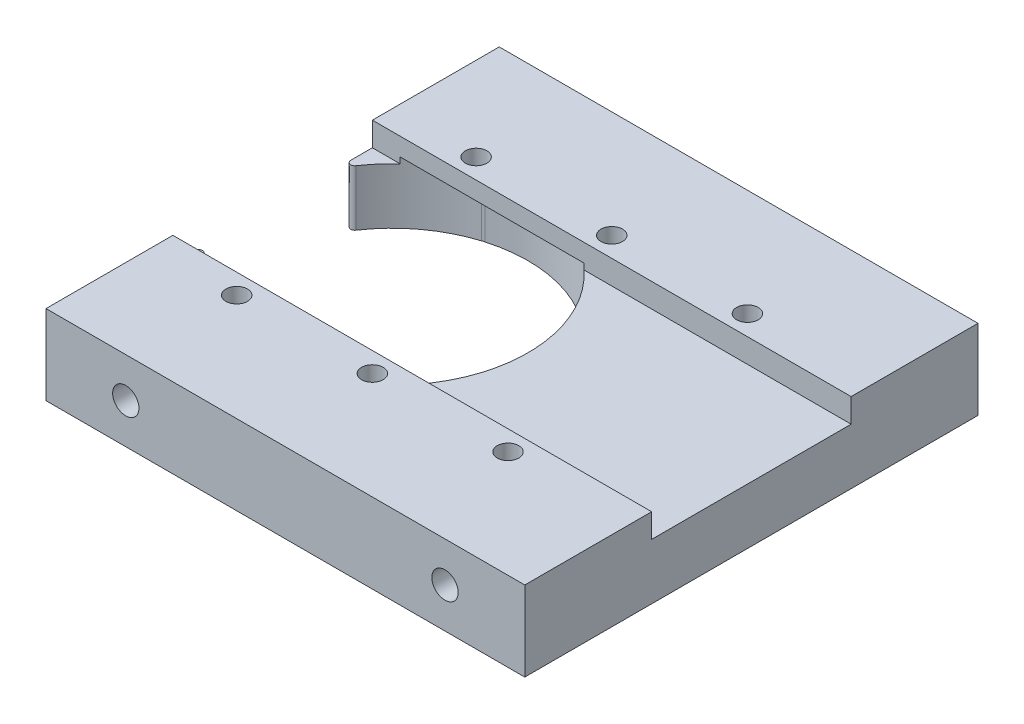
ISO-10303-21;
HEADER;
FILE_DESCRIPTION(('STEP AP214'),'2;1');
FILE_NAME('part.step','',(''),(''),'','','');
FILE_SCHEMA(('AUTOMOTIVE_DESIGN { 1 0 10303 214 1 1 1 1 }'));
ENDSEC;
DATA;
#1=APPLICATION_CONTEXT('core data for automotive mechanical design processes');
#2=APPLICATION_PROTOCOL_DEFINITION('international standard','automotive_design',2000,#1);
#3=PRODUCT_CONTEXT('',#1,'mechanical');
#4=PRODUCT('Part','Part','',(#3));
#5=PRODUCT_RELATED_PRODUCT_CATEGORY('part','',(#4));
#6=PRODUCT_DEFINITION_FORMATION('','',#4);
#7=PRODUCT_DEFINITION_CONTEXT('part definition',#1,'design');
#8=PRODUCT_DEFINITION('design','',#6,#7);
#9=PRODUCT_DEFINITION_SHAPE('','',#8);
#10=(LENGTH_UNIT() NAMED_UNIT(*) SI_UNIT(.MILLI.,.METRE.));
#11=(NAMED_UNIT(*) PLANE_ANGLE_UNIT() SI_UNIT($,.RADIAN.));
#12=(NAMED_UNIT(*) SI_UNIT($,.STERADIAN.) SOLID_ANGLE_UNIT());
#13=UNCERTAINTY_MEASURE_WITH_UNIT(LENGTH_MEASURE(1.E-05),#10,'distance_accuracy_value','');
#14=(GEOMETRIC_REPRESENTATION_CONTEXT(3) GLOBAL_UNCERTAINTY_ASSIGNED_CONTEXT((#13)) GLOBAL_UNIT_ASSIGNED_CONTEXT((#10,
#11,#12)) REPRESENTATION_CONTEXT('',''));
#15=CARTESIAN_POINT('',(0.,0.,0.));
#16=DIRECTION('',(0.,0.,1.));
#17=DIRECTION('',(1.,0.,0.));
#18=AXIS2_PLACEMENT_3D('',#15,#16,#17);
#19=CARTESIAN_POINT('',(0.,7.,0.));
#20=DIRECTION('',(0.,1.,0.));
#21=DIRECTION('',(0.,0.,1.));
#22=AXIS2_PLACEMENT_3D('',#19,#20,#21);
#23=PLANE('',#22);
#24=DIRECTION('',(-1.,0.,0.));
#25=VECTOR('',#24,1.);
#26=CARTESIAN_POINT('',(0.,7.,-6.52105263157888));
#27=LINE('',#26,#25);
#28=CARTESIAN_POINT('',(-32.5947010779433,7.,-6.52105263157891));
#29=VERTEX_POINT('',#28);
#30=CARTESIAN_POINT('',(-36.0729824561403,7.,-6.52105263157891));
#31=VERTEX_POINT('',#30);
#32=EDGE_CURVE('E421',#29,#31,#27,.T.);
#33=ORIENTED_EDGE('',*,*,#32,.T.);
#34=DIRECTION('',(0.,0.,1.));
#35=VECTOR('',#34,1.);
#36=CARTESIAN_POINT('',(-36.0729824561403,7.,0.));
#37=LINE('',#36,#35);
#38=CARTESIAN_POINT('',(-36.0729824561403,7.,-3.81901160271162));
#39=VERTEX_POINT('',#38);
#40=EDGE_CURVE('E495',#31,#39,#37,.T.);
#41=ORIENTED_EDGE('',*,*,#40,.T.);
#42=CARTESIAN_POINT('',(-35.5729824561403,7.,-3.81901160271162));
#43=DIRECTION('',(0.,1.,0.));
#44=DIRECTION('',(0.,0.,1.));
#45=AXIS2_PLACEMENT_3D('',#42,#43,#44);
#46=CIRCLE('',#45,0.5);
#47=CARTESIAN_POINT('',(-35.1586967418546,7.,-3.53906991782212));
#48=VERTEX_POINT('',#47);
#49=EDGE_CURVE('E498',#39,#48,#46,.T.);
#50=ORIENTED_EDGE('',*,*,#49,.T.);
#51=CARTESIAN_POINT('',(-21.0729824561403,7.,5.97894736842108));
#52=DIRECTION('',(0.,1.,0.));
#53=DIRECTION('',(0.,0.,1.));
#54=AXIS2_PLACEMENT_3D('',#51,#52,#53);
#55=CIRCLE('',#54,17.);
#56=EDGE_CURVE('E502',#29,#48,#55,.T.);
#57=ORIENTED_EDGE('',*,*,#56,.F.);
#58=EDGE_LOOP('',(#33,#41,#50,#57));
#59=FACE_BOUND('',#58,.T.);
#60=ADVANCED_FACE('F195',(#59),#23,.T.);
#61=DIRECTION('',(-1.,0.,0.));
#62=VECTOR('',#61,1.);
#63=CARTESIAN_POINT('',(0.,7.,-6.52105263157891));
#64=LINE('',#63,#62);
#65=CARTESIAN_POINT('',(23.9270175438597,7.,-6.52105263157891));
#66=VERTEX_POINT('',#65);
#67=CARTESIAN_POINT('',(-9.55126383433742,7.,-6.52105263157891));
#68=VERTEX_POINT('',#67);
#69=EDGE_CURVE('E341',#66,#68,#64,.T.);
#70=ORIENTED_EDGE('',*,*,#69,.T.);
#71=CARTESIAN_POINT('',(-21.0729824561403,7.,5.97894736842108));
#72=DIRECTION('',(0.,1.,0.));
#73=DIRECTION('',(0.,0.,1.));
#74=AXIS2_PLACEMENT_3D('',#71,#72,#73);
#75=CIRCLE('',#74,17.);
#76=CARTESIAN_POINT('',(-9.55126383433743,7.,18.4789473684211));
#77=VERTEX_POINT('',#76);
#78=EDGE_CURVE('E479',#77,#68,#75,.T.);
#79=ORIENTED_EDGE('',*,*,#78,.F.);
#80=DIRECTION('',(-1.,0.,0.));
#81=VECTOR('',#80,1.);
#82=CARTESIAN_POINT('',(0.,7.,18.4789473684211));
#83=LINE('',#82,#81);
#84=CARTESIAN_POINT('',(23.9270175438597,7.,18.4789473684211));
#85=VERTEX_POINT('',#84);
#86=EDGE_CURVE('E453',#85,#77,#83,.T.);
#87=ORIENTED_EDGE('',*,*,#86,.F.);
#88=DIRECTION('',(0.,0.,1.));
#89=VECTOR('',#88,1.);
#90=CARTESIAN_POINT('',(23.9270175438597,7.,0.));
#91=LINE('',#90,#89);
#92=EDGE_CURVE('E211',#66,#85,#91,.T.);
#93=ORIENTED_EDGE('',*,*,#92,.F.);
#94=EDGE_LOOP('',(#70,#79,#87,#93));
#95=FACE_BOUND('',#94,.T.);
#96=ADVANCED_FACE('F615',(#95),#23,.T.);
#97=CARTESIAN_POINT('',(-25.5729824561403,7.,20.9789473684211));
#98=DIRECTION('',(0.,-1.,0.));
#99=DIRECTION('',(0.,0.,-1.));
#100=AXIS2_PLACEMENT_3D('',#97,#98,#99);
#101=CYLINDRICAL_SURFACE('',#100,1.35);
#102=CARTESIAN_POINT('',(-25.5729824561403,0.,20.9789473684211));
#103=DIRECTION('',(0.,1.,0.));
#104=DIRECTION('',(0.,0.,1.));
#105=AXIS2_PLACEMENT_3D('',#102,#103,#104);
#106=CIRCLE('',#105,1.35);
#107=CARTESIAN_POINT('',(-26.1250182692784,0.,22.210919957813));
#108=VERTEX_POINT('',#107);
#109=CARTESIAN_POINT('',(-25.7902585696078,0.,22.3113478677142));
#110=VERTEX_POINT('',#109);
#111=EDGE_CURVE('E509',#108,#110,#106,.T.);
#112=ORIENTED_EDGE('',*,*,#111,.F.);
#113=DIRECTION('',(0.,-1.,0.));
#114=VECTOR('',#113,1.);
#115=CARTESIAN_POINT('',(-26.1250182692784,7.,22.210919957813));
#116=LINE('',#115,#114);
#117=CARTESIAN_POINT('',(-26.1250182692783,7.75,22.210919957813));
#118=VERTEX_POINT('',#117);
#119=EDGE_CURVE('E580',#118,#108,#116,.T.);
#120=ORIENTED_EDGE('',*,*,#119,.F.);
#121=CARTESIAN_POINT('',(-25.5729824561403,7.75,20.9789473684211));
#122=DIRECTION('',(0.,1.,0.));
#123=DIRECTION('',(0.,0.,1.));
#124=AXIS2_PLACEMENT_3D('',#121,#122,#123);
#125=CIRCLE('',#124,1.35);
#126=CARTESIAN_POINT('',(-25.7902585696078,7.75,22.3113478677142));
#127=VERTEX_POINT('',#126);
#128=EDGE_CURVE('E383',#118,#127,#125,.F.);
#129=ORIENTED_EDGE('',*,*,#128,.T.);
#130=DIRECTION('',(0.,-1.,0.));
#131=VECTOR('',#130,1.);
#132=CARTESIAN_POINT('',(-25.7902585696078,7.,22.3113478677142));
#133=LINE('',#132,#131);
#134=EDGE_CURVE('E583',#127,#110,#133,.T.);
#135=ORIENTED_EDGE('',*,*,#134,.T.);
#136=EDGE_LOOP('',(#112,#120,#129,#135));
#137=FACE_BOUND('',#136,.T.);
#138=CARTESIAN_POINT('',(-25.5729824561403,10.,20.9789473684211));
#139=DIRECTION('',(0.,1.,0.));
#140=DIRECTION('',(0.,0.,1.));
#141=AXIS2_PLACEMENT_3D('',#138,#139,#140);
#142=CIRCLE('',#141,1.35);
#143=CARTESIAN_POINT('',(-25.5729824561403,10.,22.3289473684211));
#144=VERTEX_POINT('',#143);
#145=EDGE_CURVE('E392',#144,#144,#142,.F.);
#146=ORIENTED_EDGE('',*,*,#145,.F.);
#147=EDGE_LOOP('',(#146));
#148=FACE_BOUND('',#147,.T.);
#149=ADVANCED_FACE('F622',(#137,#148),#101,.F.);
#150=CARTESIAN_POINT('',(-21.0729824561403,7.,5.97894736842108));
#151=DIRECTION('',(0.,-1.,0.));
#152=DIRECTION('',(0.,0.,-1.));
#153=AXIS2_PLACEMENT_3D('',#150,#151,#152);
#154=CYLINDRICAL_SURFACE('',#153,17.);
#155=CARTESIAN_POINT('',(-21.0729824561403,0.,5.97894736842108));
#156=DIRECTION('',(0.,1.,0.));
#157=DIRECTION('',(0.,0.,1.));
#158=AXIS2_PLACEMENT_3D('',#155,#156,#157);
#159=CIRCLE('',#158,17.);
#160=CARTESIAN_POINT('',(-35.1586967418546,0.,15.4969646546643));
#161=VERTEX_POINT('',#160);
#162=EDGE_CURVE('E513',#161,#108,#159,.T.);
#163=ORIENTED_EDGE('',*,*,#162,.F.);
#164=DIRECTION('',(0.,-1.,0.));
#165=VECTOR('',#164,1.);
#166=CARTESIAN_POINT('',(-35.1586967418546,7.,15.4969646546643));
#167=LINE('',#166,#165);
#168=CARTESIAN_POINT('',(-35.1586967418546,7.,15.4969646546643));
#169=VERTEX_POINT('',#168);
#170=EDGE_CURVE('E577',#169,#161,#167,.T.);
#171=ORIENTED_EDGE('',*,*,#170,.F.);
#172=CARTESIAN_POINT('',(-21.0729824561403,7.,5.97894736842108));
#173=DIRECTION('',(0.,1.,0.));
#174=DIRECTION('',(0.,0.,1.));
#175=AXIS2_PLACEMENT_3D('',#172,#173,#174);
#176=CIRCLE('',#175,17.);
#177=CARTESIAN_POINT('',(-32.5947010779433,7.,18.4789473684211));
#178=VERTEX_POINT('',#177);
#179=EDGE_CURVE('E483',#169,#178,#176,.T.);
#180=ORIENTED_EDGE('',*,*,#179,.T.);
#181=DIRECTION('',(0.,-1.,0.));
#182=VECTOR('',#181,1.);
#183=CARTESIAN_POINT('',(-32.5947010779433,7.75,18.4789473684211));
#184=LINE('',#183,#182);
#185=CARTESIAN_POINT('',(-32.5947010779433,7.75,18.4789473684211));
#186=VERTEX_POINT('',#185);
#187=EDGE_CURVE('E474',#186,#178,#184,.T.);
#188=ORIENTED_EDGE('',*,*,#187,.F.);
#189=CARTESIAN_POINT('',(-21.0729824561403,7.75,5.97894736842108));
#190=DIRECTION('',(0.,1.,0.));
#191=DIRECTION('',(0.,0.,1.));
#192=AXIS2_PLACEMENT_3D('',#189,#190,#191);
#193=CIRCLE('',#192,17.);
#194=EDGE_CURVE('E448',#118,#186,#193,.F.);
#195=ORIENTED_EDGE('',*,*,#194,.F.);
#196=ORIENTED_EDGE('',*,*,#119,.T.);
#197=EDGE_LOOP('',(#163,#171,#180,#188,#195,#196));
#198=FACE_BOUND('',#197,.T.);
#199=ADVANCED_FACE('F673',(#198),#154,.F.);
#200=CARTESIAN_POINT('',(-35.5729824561403,7.,15.7769063395538));
#201=DIRECTION('',(0.,-1.,0.));
#202=DIRECTION('',(0.,0.,-1.));
#203=AXIS2_PLACEMENT_3D('',#200,#201,#202);
#204=CYLINDRICAL_SURFACE('',#203,0.5);
#205=CARTESIAN_POINT('',(-35.5729824561403,0.,15.7769063395538));
#206=DIRECTION('',(0.,1.,0.));
#207=DIRECTION('',(0.,0.,1.));
#208=AXIS2_PLACEMENT_3D('',#205,#206,#207);
#209=CIRCLE('',#208,0.5);
#210=CARTESIAN_POINT('',(-36.0729824561403,0.,15.7769063395538));
#211=VERTEX_POINT('',#210);
#212=EDGE_CURVE('E517',#161,#211,#209,.T.);
#213=ORIENTED_EDGE('',*,*,#212,.T.);
#214=DIRECTION('',(0.,-1.,0.));
#215=VECTOR('',#214,1.);
#216=CARTESIAN_POINT('',(-36.0729824561403,7.,15.7769063395538));
#217=LINE('',#216,#215);
#218=CARTESIAN_POINT('',(-36.0729824561403,7.,15.7769063395538));
#219=VERTEX_POINT('',#218);
#220=EDGE_CURVE('E573',#219,#211,#217,.T.);
#221=ORIENTED_EDGE('',*,*,#220,.F.);
#222=CARTESIAN_POINT('',(-35.5729824561403,7.,15.7769063395538));
#223=DIRECTION('',(0.,1.,0.));
#224=DIRECTION('',(0.,0.,1.));
#225=AXIS2_PLACEMENT_3D('',#222,#223,#224);
#226=CIRCLE('',#225,0.5);
#227=EDGE_CURVE('E487',#169,#219,#226,.T.);
#228=ORIENTED_EDGE('',*,*,#227,.F.);
#229=ORIENTED_EDGE('',*,*,#170,.T.);
#230=EDGE_LOOP('',(#213,#221,#228,#229));
#231=FACE_BOUND('',#230,.T.);
#232=ADVANCED_FACE('F669',(#231),#204,.T.);
#233=CARTESIAN_POINT('',(-36.0729824561403,7.,0.));
#234=DIRECTION('',(1.,0.,0.));
#235=DIRECTION('',(0.,0.,-1.));
#236=AXIS2_PLACEMENT_3D('',#233,#234,#235);
#237=PLANE('',#236);
#238=DIRECTION('',(0.,0.,1.));
#239=VECTOR('',#238,1.);
#240=CARTESIAN_POINT('',(-36.0729824561403,0.,0.));
#241=LINE('',#240,#239);
#242=CARTESIAN_POINT('',(-36.0729824561403,0.,34.3789473684211));
#243=VERTEX_POINT('',#242);
#244=EDGE_CURVE('E520',#211,#243,#241,.T.);
#245=ORIENTED_EDGE('',*,*,#244,.T.);
#246=DIRECTION('',(0.,-1.,0.));
#247=VECTOR('',#246,1.);
#248=CARTESIAN_POINT('',(-36.0729824561403,7.,34.3789473684211));
#249=LINE('',#248,#247);
#250=CARTESIAN_POINT('',(-36.0729824561403,10.,34.3789473684211));
#251=VERTEX_POINT('',#250);
#252=EDGE_CURVE('E570',#251,#243,#249,.T.);
#253=ORIENTED_EDGE('',*,*,#252,.F.);
#254=DIRECTION('',(0.,0.,1.));
#255=VECTOR('',#254,1.);
#256=CARTESIAN_POINT('',(-36.0729824561403,10.,0.));
#257=LINE('',#256,#255);
#258=CARTESIAN_POINT('',(-36.0729824561403,10.,18.4789473684211));
#259=VERTEX_POINT('',#258);
#260=EDGE_CURVE('E405',#259,#251,#257,.T.);
#261=ORIENTED_EDGE('',*,*,#260,.F.);
#262=DIRECTION('',(0.,-1.,0.));
#263=VECTOR('',#262,1.);
#264=CARTESIAN_POINT('',(-36.0729824561403,7.75,18.4789473684211));
#265=LINE('',#264,#263);
#266=CARTESIAN_POINT('',(-36.0729824561403,7.,18.4789473684211));
#267=VERTEX_POINT('',#266);
#268=EDGE_CURVE('E470',#259,#267,#265,.T.);
#269=ORIENTED_EDGE('',*,*,#268,.T.);
#270=DIRECTION('',(0.,0.,1.));
#271=VECTOR('',#270,1.);
#272=CARTESIAN_POINT('',(-36.0729824561403,7.,0.));
#273=LINE('',#272,#271);
#274=EDGE_CURVE('E490',#219,#267,#273,.T.);
#275=ORIENTED_EDGE('',*,*,#274,.F.);
#276=ORIENTED_EDGE('',*,*,#220,.T.);
#277=EDGE_LOOP('',(#245,#253,#261,#269,#275,#276));
#278=FACE_BOUND('',#277,.T.);
#279=ADVANCED_FACE('F665',(#278),#237,.F.);
#280=CARTESIAN_POINT('',(0.,7.,34.3789473684211));
#281=DIRECTION('',(0.,0.,1.));
#282=DIRECTION('',(1.,0.,0.));
#283=AXIS2_PLACEMENT_3D('',#280,#281,#282);
#284=PLANE('',#283);
#285=CARTESIAN_POINT('',(-26.0729824561403,5.,34.3789473684211));
#286=DIRECTION('',(0.,0.,1.));
#287=DIRECTION('',(1.,0.,0.));
#288=AXIS2_PLACEMENT_3D('',#285,#286,#287);
#289=CIRCLE('',#288,1.65);
#290=CARTESIAN_POINT('',(-24.4229824561403,5.,34.3789473684211));
#291=VERTEX_POINT('',#290);
#292=EDGE_CURVE('E791',#291,#291,#289,.T.);
#293=ORIENTED_EDGE('',*,*,#292,.F.);
#294=EDGE_LOOP('',(#293));
#295=FACE_BOUND('',#294,.T.);
#296=CARTESIAN_POINT('',(13.9270175438597,5.,34.3789473684211));
#297=DIRECTION('',(0.,0.,1.));
#298=DIRECTION('',(1.,0.,0.));
#299=AXIS2_PLACEMENT_3D('',#296,#297,#298);
#300=CIRCLE('',#299,1.65);
#301=CARTESIAN_POINT('',(15.5770175438597,5.,34.3789473684211));
#302=VERTEX_POINT('',#301);
#303=EDGE_CURVE('E776',#302,#302,#300,.T.);
#304=ORIENTED_EDGE('',*,*,#303,.F.);
#305=EDGE_LOOP('',(#304));
#306=FACE_BOUND('',#305,.T.);
#307=DIRECTION('',(-1.,0.,0.));
#308=VECTOR('',#307,1.);
#309=CARTESIAN_POINT('',(0.,0.,34.3789473684211));
#310=LINE('',#309,#308);
#311=CARTESIAN_POINT('',(23.9270175438597,0.,34.3789473684211));
#312=VERTEX_POINT('',#311);
#313=EDGE_CURVE('E524',#312,#243,#310,.T.);
#314=ORIENTED_EDGE('',*,*,#313,.F.);
#315=DIRECTION('',(0.,-1.,0.));
#316=VECTOR('',#315,1.);
#317=CARTESIAN_POINT('',(23.9270175438597,7.,34.3789473684211));
#318=LINE('',#317,#316);
#319=CARTESIAN_POINT('',(23.9270175438597,10.,34.3789473684211));
#320=VERTEX_POINT('',#319);
#321=EDGE_CURVE('E567',#320,#312,#318,.T.);
#322=ORIENTED_EDGE('',*,*,#321,.F.);
#323=DIRECTION('',(1.,0.,0.));
#324=VECTOR('',#323,1.);
#325=CARTESIAN_POINT('',(0.,10.,34.3789473684211));
#326=LINE('',#325,#324);
#327=EDGE_CURVE('E409',#251,#320,#326,.T.);
#328=ORIENTED_EDGE('',*,*,#327,.F.);
#329=ORIENTED_EDGE('',*,*,#252,.T.);
#330=EDGE_LOOP('',(#314,#322,#328,#329));
#331=FACE_BOUND('',#330,.T.);
#332=ADVANCED_FACE('F662',(#295,#306,#331),#284,.T.);
#333=CARTESIAN_POINT('',(23.9270175438597,7.,0.));
#334=DIRECTION('',(1.,0.,0.));
#335=DIRECTION('',(0.,0.,-1.));
#336=AXIS2_PLACEMENT_3D('',#333,#334,#335);
#337=PLANE('',#336);
#338=DIRECTION('',(0.,0.,1.));
#339=VECTOR('',#338,1.);
#340=CARTESIAN_POINT('',(23.9270175438597,0.,0.));
#341=LINE('',#340,#339);
#342=CARTESIAN_POINT('',(23.9270175438597,0.,-22.4210526315789));
#343=VERTEX_POINT('',#342);
#344=EDGE_CURVE('E528',#343,#312,#341,.T.);
#345=ORIENTED_EDGE('',*,*,#344,.F.);
#346=DIRECTION('',(0.,-1.,0.));
#347=VECTOR('',#346,1.);
#348=CARTESIAN_POINT('',(23.9270175438597,7.,-22.4210526315789));
#349=LINE('',#348,#347);
#350=CARTESIAN_POINT('',(23.9270175438597,10.,-22.4210526315789));
#351=VERTEX_POINT('',#350);
#352=EDGE_CURVE('E350',#351,#343,#349,.T.);
#353=ORIENTED_EDGE('',*,*,#352,.F.);
#354=DIRECTION('',(0.,0.,-1.));
#355=VECTOR('',#354,1.);
#356=CARTESIAN_POINT('',(23.9270175438597,10.,0.));
#357=LINE('',#356,#355);
#358=CARTESIAN_POINT('',(23.9270175438597,10.,-6.52105263157891));
#359=VERTEX_POINT('',#358);
#360=EDGE_CURVE('E347',#359,#351,#357,.T.);
#361=ORIENTED_EDGE('',*,*,#360,.F.);
#362=DIRECTION('',(0.,-1.,0.));
#363=VECTOR('',#362,1.);
#364=CARTESIAN_POINT('',(23.9270175438597,7.75,-6.52105263157891));
#365=LINE('',#364,#363);
#366=EDGE_CURVE('E334',#359,#66,#365,.T.);
#367=ORIENTED_EDGE('',*,*,#366,.T.);
#368=ORIENTED_EDGE('',*,*,#92,.T.);
#369=DIRECTION('',(0.,-1.,0.));
#370=VECTOR('',#369,1.);
#371=CARTESIAN_POINT('',(23.9270175438597,7.75,18.4789473684211));
#372=LINE('',#371,#370);
#373=CARTESIAN_POINT('',(23.9270175438597,10.,18.4789473684211));
#374=VERTEX_POINT('',#373);
#375=EDGE_CURVE('E466',#374,#85,#372,.T.);
#376=ORIENTED_EDGE('',*,*,#375,.F.);
#377=DIRECTION('',(0.,0.,-1.));
#378=VECTOR('',#377,1.);
#379=CARTESIAN_POINT('',(23.9270175438597,10.,0.));
#380=LINE('',#379,#378);
#381=EDGE_CURVE('E396',#320,#374,#380,.T.);
#382=ORIENTED_EDGE('',*,*,#381,.F.);
#383=ORIENTED_EDGE('',*,*,#321,.T.);
#384=EDGE_LOOP('',(#345,#353,#361,#367,#368,#376,#382,#383));
#385=FACE_BOUND('',#384,.T.);
#386=ADVANCED_FACE('F349',(#385),#337,.T.);
#387=CARTESIAN_POINT('',(0.,7.,-22.4210526315789));
#388=DIRECTION('',(0.,0.,-1.));
#389=DIRECTION('',(-1.,0.,0.));
#390=AXIS2_PLACEMENT_3D('',#387,#388,#389);
#391=PLANE('',#390);
#392=CARTESIAN_POINT('',(-26.0729824561403,5.,-22.4210526315789));
#393=DIRECTION('',(0.,0.,-1.));
#394=DIRECTION('',(-1.,0.,0.));
#395=AXIS2_PLACEMENT_3D('',#392,#393,#394);
#396=CIRCLE('',#395,1.65);
#397=CARTESIAN_POINT('',(-27.7229824561403,5.,-22.4210526315789));
#398=VERTEX_POINT('',#397);
#399=EDGE_CURVE('E771',#398,#398,#396,.T.);
#400=ORIENTED_EDGE('',*,*,#399,.F.);
#401=EDGE_LOOP('',(#400));
#402=FACE_BOUND('',#401,.T.);
#403=CARTESIAN_POINT('',(13.9270175438597,4.99999999999999,-22.4210526315789));
#404=DIRECTION('',(0.,0.,-1.));
#405=DIRECTION('',(-1.,0.,0.));
#406=AXIS2_PLACEMENT_3D('',#403,#404,#405);
#407=CIRCLE('',#406,1.65);
#408=CARTESIAN_POINT('',(12.2770175438597,4.99999999999999,-22.4210526315789));
#409=VERTEX_POINT('',#408);
#410=EDGE_CURVE('E778',#409,#409,#407,.T.);
#411=ORIENTED_EDGE('',*,*,#410,.F.);
#412=EDGE_LOOP('',(#411));
#413=FACE_BOUND('',#412,.T.);
#414=DIRECTION('',(1.,0.,0.));
#415=VECTOR('',#414,1.);
#416=CARTESIAN_POINT('',(0.,0.,-22.4210526315789));
#417=LINE('',#416,#415);
#418=CARTESIAN_POINT('',(-36.0729824561403,0.,-22.4210526315789));
#419=VERTEX_POINT('',#418);
#420=EDGE_CURVE('E532',#419,#343,#417,.T.);
#421=ORIENTED_EDGE('',*,*,#420,.F.);
#422=DIRECTION('',(0.,-1.,0.));
#423=VECTOR('',#422,1.);
#424=CARTESIAN_POINT('',(-36.0729824561403,7.,-22.4210526315789));
#425=LINE('',#424,#423);
#426=CARTESIAN_POINT('',(-36.0729824561403,10.,-22.4210526315789));
#427=VERTEX_POINT('',#426);
#428=EDGE_CURVE('E562',#427,#419,#425,.T.);
#429=ORIENTED_EDGE('',*,*,#428,.F.);
#430=DIRECTION('',(-1.,0.,0.));
#431=VECTOR('',#430,1.);
#432=CARTESIAN_POINT('',(0.,10.,-22.4210526315789));
#433=LINE('',#432,#431);
#434=EDGE_CURVE('E355',#351,#427,#433,.T.);
#435=ORIENTED_EDGE('',*,*,#434,.F.);
#436=ORIENTED_EDGE('',*,*,#352,.T.);
#437=EDGE_LOOP('',(#421,#429,#435,#436));
#438=FACE_BOUND('',#437,.T.);
#439=ADVANCED_FACE('F655',(#402,#413,#438),#391,.T.);
#440=CARTESIAN_POINT('',(-36.0729824561403,7.,0.));
#441=DIRECTION('',(1.,0.,0.));
#442=DIRECTION('',(0.,0.,-1.));
#443=AXIS2_PLACEMENT_3D('',#440,#441,#442);
#444=PLANE('',#443);
#445=DIRECTION('',(0.,0.,1.));
#446=VECTOR('',#445,1.);
#447=CARTESIAN_POINT('',(-36.0729824561403,0.,0.));
#448=LINE('',#447,#446);
#449=CARTESIAN_POINT('',(-36.0729824561403,0.,-3.81901160271162));
#450=VERTEX_POINT('',#449);
#451=EDGE_CURVE('E536',#419,#450,#448,.T.);
#452=ORIENTED_EDGE('',*,*,#451,.T.);
#453=DIRECTION('',(0.,-1.,0.));
#454=VECTOR('',#453,1.);
#455=CARTESIAN_POINT('',(-36.0729824561403,7.,-3.81901160271162));
#456=LINE('',#455,#454);
#457=EDGE_CURVE('E558',#39,#450,#456,.T.);
#458=ORIENTED_EDGE('',*,*,#457,.F.);
#459=ORIENTED_EDGE('',*,*,#40,.F.);
#460=DIRECTION('',(0.,-1.,0.));
#461=VECTOR('',#460,1.);
#462=CARTESIAN_POINT('',(-36.0729824561403,7.75,-6.52105263157891));
#463=LINE('',#462,#461);
#464=CARTESIAN_POINT('',(-36.0729824561403,10.,-6.52105263157891));
#465=VERTEX_POINT('',#464);
#466=EDGE_CURVE('E344',#465,#31,#463,.T.);
#467=ORIENTED_EDGE('',*,*,#466,.F.);
#468=DIRECTION('',(0.,0.,1.));
#469=VECTOR('',#468,1.);
#470=CARTESIAN_POINT('',(-36.0729824561403,10.,0.));
#471=LINE('',#470,#469);
#472=EDGE_CURVE('E361',#427,#465,#471,.T.);
#473=ORIENTED_EDGE('',*,*,#472,.F.);
#474=ORIENTED_EDGE('',*,*,#428,.T.);
#475=EDGE_LOOP('',(#452,#458,#459,#467,#473,#474));
#476=FACE_BOUND('',#475,.T.);
#477=ADVANCED_FACE('F651',(#476),#444,.F.);
#478=CARTESIAN_POINT('',(-35.5729824561403,7.,-3.81901160271162));
#479=DIRECTION('',(0.,-1.,0.));
#480=DIRECTION('',(0.,0.,-1.));
#481=AXIS2_PLACEMENT_3D('',#478,#479,#480);
#482=CYLINDRICAL_SURFACE('',#481,0.5);
#483=CARTESIAN_POINT('',(-35.5729824561403,0.,-3.81901160271162));
#484=DIRECTION('',(0.,1.,0.));
#485=DIRECTION('',(0.,0.,1.));
#486=AXIS2_PLACEMENT_3D('',#483,#484,#485);
#487=CIRCLE('',#486,0.5);
#488=CARTESIAN_POINT('',(-35.1586967418546,0.,-3.53906991782212));
#489=VERTEX_POINT('',#488);
#490=EDGE_CURVE('E539',#450,#489,#487,.T.);
#491=ORIENTED_EDGE('',*,*,#490,.T.);
#492=DIRECTION('',(0.,-1.,0.));
#493=VECTOR('',#492,1.);
#494=CARTESIAN_POINT('',(-35.1586967418546,7.,-3.53906991782212));
#495=LINE('',#494,#493);
#496=EDGE_CURVE('E555',#48,#489,#495,.T.);
#497=ORIENTED_EDGE('',*,*,#496,.F.);
#498=ORIENTED_EDGE('',*,*,#49,.F.);
#499=ORIENTED_EDGE('',*,*,#457,.T.);
#500=EDGE_LOOP('',(#491,#497,#498,#499));
#501=FACE_BOUND('',#500,.T.);
#502=ADVANCED_FACE('F647',(#501),#482,.T.);
#503=CARTESIAN_POINT('',(-21.0729824561403,7.,5.97894736842108));
#504=DIRECTION('',(0.,-1.,0.));
#505=DIRECTION('',(0.,0.,-1.));
#506=AXIS2_PLACEMENT_3D('',#503,#504,#505);
#507=CYLINDRICAL_SURFACE('',#506,17.);
#508=CARTESIAN_POINT('',(-21.0729824561403,0.,5.97894736842108));
#509=DIRECTION('',(0.,1.,0.));
#510=DIRECTION('',(0.,0.,1.));
#511=AXIS2_PLACEMENT_3D('',#508,#509,#510);
#512=CIRCLE('',#511,17.);
#513=CARTESIAN_POINT('',(-26.1250182692783,0.,-10.2530252209709));
#514=VERTEX_POINT('',#513);
#515=EDGE_CURVE('E543',#514,#489,#512,.T.);
#516=ORIENTED_EDGE('',*,*,#515,.F.);
#517=DIRECTION('',(0.,-1.,0.));
#518=VECTOR('',#517,1.);
#519=CARTESIAN_POINT('',(-26.1250182692783,7.,-10.2530252209709));
#520=LINE('',#519,#518);
#521=CARTESIAN_POINT('',(-26.1250182692783,7.75,-10.2530252209709));
#522=VERTEX_POINT('',#521);
#523=EDGE_CURVE('E552',#522,#514,#520,.T.);
#524=ORIENTED_EDGE('',*,*,#523,.F.);
#525=CARTESIAN_POINT('',(-21.0729824561403,7.75,5.97894736842108));
#526=DIRECTION('',(0.,1.,0.));
#527=DIRECTION('',(0.,0.,1.));
#528=AXIS2_PLACEMENT_3D('',#525,#526,#527);
#529=CIRCLE('',#528,17.);
#530=CARTESIAN_POINT('',(-32.5947010779433,7.75,-6.52105263157891));
#531=VERTEX_POINT('',#530);
#532=EDGE_CURVE('E428',#531,#522,#529,.F.);
#533=ORIENTED_EDGE('',*,*,#532,.F.);
#534=DIRECTION('',(0.,-1.,0.));
#535=VECTOR('',#534,1.);
#536=CARTESIAN_POINT('',(-32.5947010779433,7.75,-6.52105263157891));
#537=LINE('',#536,#535);
#538=EDGE_CURVE('E445',#531,#29,#537,.T.);
#539=ORIENTED_EDGE('',*,*,#538,.T.);
#540=ORIENTED_EDGE('',*,*,#56,.T.);
#541=ORIENTED_EDGE('',*,*,#496,.T.);
#542=EDGE_LOOP('',(#516,#524,#533,#539,#540,#541));
#543=FACE_BOUND('',#542,.T.);
#544=ADVANCED_FACE('F643',(#543),#507,.F.);
#545=CARTESIAN_POINT('',(-25.5729824561403,7.,-9.02105263157891));
#546=DIRECTION('',(0.,-1.,0.));
#547=DIRECTION('',(0.,0.,-1.));
#548=AXIS2_PLACEMENT_3D('',#545,#546,#547);
#549=CYLINDRICAL_SURFACE('',#548,1.35);
#550=CARTESIAN_POINT('',(-25.5729824561403,0.,-9.02105263157891));
#551=DIRECTION('',(0.,1.,0.));
#552=DIRECTION('',(0.,0.,1.));
#553=AXIS2_PLACEMENT_3D('',#550,#551,#552);
#554=CIRCLE('',#553,1.35);
#555=CARTESIAN_POINT('',(-25.7902585696079,0.,-10.353453130872));
#556=VERTEX_POINT('',#555);
#557=EDGE_CURVE('E484',#556,#514,#554,.T.);
#558=ORIENTED_EDGE('',*,*,#557,.F.);
#559=DIRECTION('',(0.,-1.,0.));
#560=VECTOR('',#559,1.);
#561=CARTESIAN_POINT('',(-25.7902585696079,7.,-10.353453130872));
#562=LINE('',#561,#560);
#563=CARTESIAN_POINT('',(-25.7902585696079,7.75,-10.353453130872));
#564=VERTEX_POINT('',#563);
#565=EDGE_CURVE('E505',#564,#556,#562,.T.);
#566=ORIENTED_EDGE('',*,*,#565,.F.);
#567=CARTESIAN_POINT('',(-25.5729824561403,7.75,-9.02105263157891));
#568=DIRECTION('',(0.,1.,0.));
#569=DIRECTION('',(0.,0.,1.));
#570=AXIS2_PLACEMENT_3D('',#567,#568,#569);
#571=CIRCLE('',#570,1.35);
#572=EDGE_CURVE('E384',#564,#522,#571,.F.);
#573=ORIENTED_EDGE('',*,*,#572,.T.);
#574=ORIENTED_EDGE('',*,*,#523,.T.);
#575=EDGE_LOOP('',(#558,#566,#573,#574));
#576=FACE_BOUND('',#575,.T.);
#577=CARTESIAN_POINT('',(-25.5729824561403,10.,-9.02105263157891));
#578=DIRECTION('',(0.,1.,0.));
#579=DIRECTION('',(0.,0.,1.));
#580=AXIS2_PLACEMENT_3D('',#577,#578,#579);
#581=CIRCLE('',#580,1.35);
#582=CARTESIAN_POINT('',(-25.5729824561403,10.,-7.67105263157891));
#583=VERTEX_POINT('',#582);
#584=EDGE_CURVE('E363',#583,#583,#581,.F.);
#585=ORIENTED_EDGE('',*,*,#584,.F.);
#586=EDGE_LOOP('',(#585));
#587=FACE_BOUND('',#586,.T.);
#588=ADVANCED_FACE('F638',(#576,#587),#549,.F.);
#589=CARTESIAN_POINT('',(-21.0729824561403,7.,5.97894736842108));
#590=DIRECTION('',(0.,-1.,0.));
#591=DIRECTION('',(0.,0.,-1.));
#592=AXIS2_PLACEMENT_3D('',#589,#590,#591);
#593=CYLINDRICAL_SURFACE('',#592,17.);
#594=CARTESIAN_POINT('',(-21.0729824561403,0.,5.97894736842108));
#595=DIRECTION('',(0.,1.,0.));
#596=DIRECTION('',(0.,0.,1.));
#597=AXIS2_PLACEMENT_3D('',#594,#595,#596);
#598=CIRCLE('',#597,17.);
#599=EDGE_CURVE('E478',#110,#556,#598,.T.);
#600=ORIENTED_EDGE('',*,*,#599,.F.);
#601=ORIENTED_EDGE('',*,*,#134,.F.);
#602=CARTESIAN_POINT('',(-21.0729824561403,7.75,5.97894736842108));
#603=DIRECTION('',(0.,1.,0.));
#604=DIRECTION('',(0.,0.,1.));
#605=AXIS2_PLACEMENT_3D('',#602,#603,#604);
#606=CIRCLE('',#605,17.);
#607=CARTESIAN_POINT('',(-9.55126383433743,7.75,18.4789473684211));
#608=VERTEX_POINT('',#607);
#609=EDGE_CURVE('E452',#608,#127,#606,.F.);
#610=ORIENTED_EDGE('',*,*,#609,.F.);
#611=DIRECTION('',(0.,-1.,0.));
#612=VECTOR('',#611,1.);
#613=CARTESIAN_POINT('',(-9.55126383433743,7.75,18.4789473684211));
#614=LINE('',#613,#612);
#615=EDGE_CURVE('E457',#608,#77,#614,.T.);
#616=ORIENTED_EDGE('',*,*,#615,.T.);
#617=ORIENTED_EDGE('',*,*,#78,.T.);
#618=DIRECTION('',(0.,-1.,0.));
#619=VECTOR('',#618,1.);
#620=CARTESIAN_POINT('',(-9.55126383433742,7.75,-6.52105263157891));
#621=LINE('',#620,#619);
#622=CARTESIAN_POINT('',(-9.55126383433742,7.75,-6.52105263157891));
#623=VERTEX_POINT('',#622);
#624=EDGE_CURVE('E343',#623,#68,#621,.T.);
#625=ORIENTED_EDGE('',*,*,#624,.F.);
#626=CARTESIAN_POINT('',(-21.0729824561403,7.75,5.97894736842108));
#627=DIRECTION('',(0.,1.,0.));
#628=DIRECTION('',(0.,0.,1.));
#629=AXIS2_PLACEMENT_3D('',#626,#627,#628);
#630=CIRCLE('',#629,17.);
#631=EDGE_CURVE('E432',#564,#623,#630,.F.);
#632=ORIENTED_EDGE('',*,*,#631,.F.);
#633=ORIENTED_EDGE('',*,*,#565,.T.);
#634=EDGE_LOOP('',(#600,#601,#610,#616,#617,#625,#632,#633));
#635=FACE_BOUND('',#634,.T.);
#636=ADVANCED_FACE('F197',(#635),#593,.F.);
#637=CARTESIAN_POINT('',(0.,0.,0.));
#638=DIRECTION('',(0.,1.,0.));
#639=DIRECTION('',(0.,0.,1.));
#640=AXIS2_PLACEMENT_3D('',#637,#638,#639);
#641=PLANE('',#640);
#642=ORIENTED_EDGE('',*,*,#599,.T.);
#643=ORIENTED_EDGE('',*,*,#557,.T.);
#644=ORIENTED_EDGE('',*,*,#515,.T.);
#645=ORIENTED_EDGE('',*,*,#490,.F.);
#646=ORIENTED_EDGE('',*,*,#451,.F.);
#647=ORIENTED_EDGE('',*,*,#420,.T.);
#648=ORIENTED_EDGE('',*,*,#344,.T.);
#649=ORIENTED_EDGE('',*,*,#313,.T.);
#650=ORIENTED_EDGE('',*,*,#244,.F.);
#651=ORIENTED_EDGE('',*,*,#212,.F.);
#652=ORIENTED_EDGE('',*,*,#162,.T.);
#653=ORIENTED_EDGE('',*,*,#111,.T.);
#654=EDGE_LOOP('',(#642,#643,#644,#645,#646,#647,#648,#649,#650,#651,#652,#653));
#655=FACE_BOUND('',#654,.T.);
#656=ADVANCED_FACE('F628',(#655),#641,.F.);
#657=DIRECTION('',(-1.,0.,0.));
#658=VECTOR('',#657,1.);
#659=CARTESIAN_POINT('',(0.,7.,18.4789473684211));
#660=LINE('',#659,#658);
#661=EDGE_CURVE('E219',#178,#267,#660,.T.);
#662=ORIENTED_EDGE('',*,*,#661,.F.);
#663=ORIENTED_EDGE('',*,*,#179,.F.);
#664=ORIENTED_EDGE('',*,*,#227,.T.);
#665=ORIENTED_EDGE('',*,*,#274,.T.);
#666=EDGE_LOOP('',(#662,#663,#664,#665));
#667=FACE_BOUND('',#666,.T.);
#668=ADVANCED_FACE('F618',(#667),#23,.T.);
#669=CARTESIAN_POINT('',(0.,7.75,18.4789473684211));
#670=DIRECTION('',(0.,0.,1.));
#671=DIRECTION('',(1.,0.,0.));
#672=AXIS2_PLACEMENT_3D('',#669,#670,#671);
#673=PLANE('',#672);
#674=ORIENTED_EDGE('',*,*,#661,.T.);
#675=ORIENTED_EDGE('',*,*,#268,.F.);
#676=DIRECTION('',(-1.,0.,0.));
#677=VECTOR('',#676,1.);
#678=CARTESIAN_POINT('',(0.,10.,18.4789473684211));
#679=LINE('',#678,#677);
#680=EDGE_CURVE('E401',#374,#259,#679,.T.);
#681=ORIENTED_EDGE('',*,*,#680,.F.);
#682=ORIENTED_EDGE('',*,*,#375,.T.);
#683=ORIENTED_EDGE('',*,*,#86,.T.);
#684=ORIENTED_EDGE('',*,*,#615,.F.);
#685=DIRECTION('',(-1.,0.,0.));
#686=VECTOR('',#685,1.);
#687=CARTESIAN_POINT('',(0.,7.75,18.4789473684211));
#688=LINE('',#687,#686);
#689=EDGE_CURVE('E397',#608,#186,#688,.T.);
#690=ORIENTED_EDGE('',*,*,#689,.T.);
#691=ORIENTED_EDGE('',*,*,#187,.T.);
#692=EDGE_LOOP('',(#674,#675,#681,#682,#683,#684,#690,#691));
#693=FACE_BOUND('',#692,.T.);
#694=ADVANCED_FACE('F627',(#693),#673,.F.);
#695=CARTESIAN_POINT('',(0.,7.75,-6.52105263157888));
#696=DIRECTION('',(0.,0.,1.));
#697=DIRECTION('',(1.,0.,0.));
#698=AXIS2_PLACEMENT_3D('',#695,#696,#697);
#699=PLANE('',#698);
#700=ORIENTED_EDGE('',*,*,#32,.F.);
#701=ORIENTED_EDGE('',*,*,#538,.F.);
#702=DIRECTION('',(1.,0.,0.));
#703=VECTOR('',#702,1.);
#704=CARTESIAN_POINT('',(0.,7.75,-6.52105263157888));
#705=LINE('',#704,#703);
#706=EDGE_CURVE('E367',#531,#623,#705,.T.);
#707=ORIENTED_EDGE('',*,*,#706,.T.);
#708=ORIENTED_EDGE('',*,*,#624,.T.);
#709=ORIENTED_EDGE('',*,*,#69,.F.);
#710=ORIENTED_EDGE('',*,*,#366,.F.);
#711=DIRECTION('',(1.,0.,0.));
#712=VECTOR('',#711,1.);
#713=CARTESIAN_POINT('',(0.,10.,-6.52105263157888));
#714=LINE('',#713,#712);
#715=EDGE_CURVE('E339',#465,#359,#714,.T.);
#716=ORIENTED_EDGE('',*,*,#715,.F.);
#717=ORIENTED_EDGE('',*,*,#466,.T.);
#718=EDGE_LOOP('',(#700,#701,#707,#708,#709,#710,#716,#717));
#719=FACE_BOUND('',#718,.T.);
#720=ADVANCED_FACE('F337',(#719),#699,.T.);
#721=CARTESIAN_POINT('',(8.42701754385967,10.,20.9789473684211));
#722=DIRECTION('',(0.,-1.,0.));
#723=DIRECTION('',(0.,0.,-1.));
#724=AXIS2_PLACEMENT_3D('',#721,#722,#723);
#725=CYLINDRICAL_SURFACE('',#724,1.35);
#726=CARTESIAN_POINT('',(8.42701754385967,10.,20.9789473684211));
#727=DIRECTION('',(0.,1.,0.));
#728=DIRECTION('',(0.,0.,1.));
#729=AXIS2_PLACEMENT_3D('',#726,#727,#728);
#730=CIRCLE('',#729,1.35);
#731=CARTESIAN_POINT('',(8.42701754385967,10.,22.3289473684211));
#732=VERTEX_POINT('',#731);
#733=EDGE_CURVE('E413',#732,#732,#730,.T.);
#734=ORIENTED_EDGE('',*,*,#733,.T.);
#735=EDGE_LOOP('',(#734));
#736=FACE_BOUND('',#735,.T.);
#737=CARTESIAN_POINT('',(8.42701754385967,7.75,20.9789473684211));
#738=DIRECTION('',(0.,1.,0.));
#739=DIRECTION('',(0.,0.,1.));
#740=AXIS2_PLACEMENT_3D('',#737,#738,#739);
#741=CIRCLE('',#740,1.35);
#742=CARTESIAN_POINT('',(8.42701754385967,7.75,22.3289473684211));
#743=VERTEX_POINT('',#742);
#744=EDGE_CURVE('E590',#743,#743,#741,.F.);
#745=ORIENTED_EDGE('',*,*,#744,.T.);
#746=EDGE_LOOP('',(#745));
#747=FACE_BOUND('',#746,.T.);
#748=ADVANCED_FACE('F700',(#736,#747),#725,.F.);
#749=CARTESIAN_POINT('',(-8.57298245614033,10.,20.9789473684211));
#750=DIRECTION('',(0.,-1.,0.));
#751=DIRECTION('',(0.,0.,-1.));
#752=AXIS2_PLACEMENT_3D('',#749,#750,#751);
#753=CYLINDRICAL_SURFACE('',#752,1.35);
#754=CARTESIAN_POINT('',(-8.57298245614033,10.,20.9789473684211));
#755=DIRECTION('',(0.,1.,0.));
#756=DIRECTION('',(0.,0.,1.));
#757=AXIS2_PLACEMENT_3D('',#754,#755,#756);
#758=CIRCLE('',#757,1.35);
#759=CARTESIAN_POINT('',(-8.57298245614033,10.,22.3289473684211));
#760=VERTEX_POINT('',#759);
#761=EDGE_CURVE('E417',#760,#760,#758,.T.);
#762=ORIENTED_EDGE('',*,*,#761,.T.);
#763=EDGE_LOOP('',(#762));
#764=FACE_BOUND('',#763,.T.);
#765=CARTESIAN_POINT('',(-8.57298245614033,7.75,20.9789473684211));
#766=DIRECTION('',(0.,1.,0.));
#767=DIRECTION('',(0.,0.,1.));
#768=AXIS2_PLACEMENT_3D('',#765,#766,#767);
#769=CIRCLE('',#768,1.35);
#770=CARTESIAN_POINT('',(-8.57298245614033,7.75,22.3289473684211));
#771=VERTEX_POINT('',#770);
#772=EDGE_CURVE('E586',#771,#771,#769,.F.);
#773=ORIENTED_EDGE('',*,*,#772,.T.);
#774=EDGE_LOOP('',(#773));
#775=FACE_BOUND('',#774,.T.);
#776=ADVANCED_FACE('F690',(#764,#775),#753,.F.);
#777=CARTESIAN_POINT('',(0.,10.,0.));
#778=DIRECTION('',(0.,1.,0.));
#779=DIRECTION('',(0.,0.,1.));
#780=AXIS2_PLACEMENT_3D('',#777,#778,#779);
#781=PLANE('',#780);
#782=ORIENTED_EDGE('',*,*,#145,.T.);
#783=EDGE_LOOP('',(#782));
#784=FACE_BOUND('',#783,.T.);
#785=ORIENTED_EDGE('',*,*,#381,.T.);
#786=ORIENTED_EDGE('',*,*,#680,.T.);
#787=ORIENTED_EDGE('',*,*,#260,.T.);
#788=ORIENTED_EDGE('',*,*,#327,.T.);
#789=EDGE_LOOP('',(#785,#786,#787,#788));
#790=FACE_BOUND('',#789,.T.);
#791=ORIENTED_EDGE('',*,*,#733,.F.);
#792=EDGE_LOOP('',(#791));
#793=FACE_BOUND('',#792,.T.);
#794=ORIENTED_EDGE('',*,*,#761,.F.);
#795=EDGE_LOOP('',(#794));
#796=FACE_BOUND('',#795,.T.);
#797=ADVANCED_FACE('F686',(#784,#790,#793,#796),#781,.T.);
#798=CARTESIAN_POINT('',(0.,7.75,0.));
#799=DIRECTION('',(0.,1.,0.));
#800=DIRECTION('',(0.,0.,1.));
#801=AXIS2_PLACEMENT_3D('',#798,#799,#800);
#802=PLANE('',#801);
#803=ORIENTED_EDGE('',*,*,#194,.T.);
#804=ORIENTED_EDGE('',*,*,#689,.F.);
#805=ORIENTED_EDGE('',*,*,#609,.T.);
#806=ORIENTED_EDGE('',*,*,#128,.F.);
#807=EDGE_LOOP('',(#803,#804,#805,#806));
#808=FACE_BOUND('',#807,.T.);
#809=ADVANCED_FACE('F689',(#808),#802,.F.);
#810=CARTESIAN_POINT('',(0.,7.75,0.));
#811=DIRECTION('',(0.,1.,0.));
#812=DIRECTION('',(0.,0.,1.));
#813=AXIS2_PLACEMENT_3D('',#810,#811,#812);
#814=PLANE('',#813);
#815=ORIENTED_EDGE('',*,*,#772,.F.);
#816=EDGE_LOOP('',(#815));
#817=FACE_BOUND('',#816,.T.);
#818=ADVANCED_FACE('F704',(#817),#814,.T.);
#819=ORIENTED_EDGE('',*,*,#744,.F.);
#820=EDGE_LOOP('',(#819));
#821=FACE_BOUND('',#820,.T.);
#822=ADVANCED_FACE('F706',(#821),#814,.T.);
#823=CARTESIAN_POINT('',(-8.57298245614034,10.,-9.02105263157891));
#824=DIRECTION('',(0.,-1.,0.));
#825=DIRECTION('',(0.,0.,-1.));
#826=AXIS2_PLACEMENT_3D('',#823,#824,#825);
#827=CYLINDRICAL_SURFACE('',#826,1.35);
#828=CARTESIAN_POINT('',(-8.57298245614034,10.,-9.02105263157891));
#829=DIRECTION('',(0.,1.,0.));
#830=DIRECTION('',(0.,0.,1.));
#831=AXIS2_PLACEMENT_3D('',#828,#829,#830);
#832=CIRCLE('',#831,1.35);
#833=CARTESIAN_POINT('',(-8.57298245614034,10.,-7.67105263157891));
#834=VERTEX_POINT('',#833);
#835=EDGE_CURVE('E375',#834,#834,#832,.T.);
#836=ORIENTED_EDGE('',*,*,#835,.T.);
#837=EDGE_LOOP('',(#836));
#838=FACE_BOUND('',#837,.T.);
#839=CARTESIAN_POINT('',(-8.57298245614034,7.75,-9.02105263157891));
#840=DIRECTION('',(0.,1.,0.));
#841=DIRECTION('',(0.,0.,1.));
#842=AXIS2_PLACEMENT_3D('',#839,#840,#841);
#843=CIRCLE('',#842,1.35);
#844=CARTESIAN_POINT('',(-8.57298245614034,7.75,-7.67105263157891));
#845=VERTEX_POINT('',#844);
#846=EDGE_CURVE('E12',#845,#845,#843,.F.);
#847=ORIENTED_EDGE('',*,*,#846,.T.);
#848=EDGE_LOOP('',(#847));
#849=FACE_BOUND('',#848,.T.);
#850=ADVANCED_FACE('F712',(#838,#849),#827,.F.);
#851=CARTESIAN_POINT('',(8.42701754385966,10.,-9.02105263157891));
#852=DIRECTION('',(0.,-1.,0.));
#853=DIRECTION('',(0.,0.,-1.));
#854=AXIS2_PLACEMENT_3D('',#851,#852,#853);
#855=CYLINDRICAL_SURFACE('',#854,1.35);
#856=CARTESIAN_POINT('',(8.42701754385966,10.,-9.02105263157891));
#857=DIRECTION('',(0.,1.,0.));
#858=DIRECTION('',(0.,0.,1.));
#859=AXIS2_PLACEMENT_3D('',#856,#857,#858);
#860=CIRCLE('',#859,1.35);
#861=CARTESIAN_POINT('',(8.42701754385966,10.,-7.67105263157891));
#862=VERTEX_POINT('',#861);
#863=EDGE_CURVE('E379',#862,#862,#860,.T.);
#864=ORIENTED_EDGE('',*,*,#863,.T.);
#865=EDGE_LOOP('',(#864));
#866=FACE_BOUND('',#865,.T.);
#867=CARTESIAN_POINT('',(8.42701754385966,7.75,-9.02105263157891));
#868=DIRECTION('',(0.,1.,0.));
#869=DIRECTION('',(0.,0.,1.));
#870=AXIS2_PLACEMENT_3D('',#867,#868,#869);
#871=CIRCLE('',#870,1.35);
#872=CARTESIAN_POINT('',(8.42701754385966,7.75,-7.67105263157891));
#873=VERTEX_POINT('',#872);
#874=EDGE_CURVE('E204',#873,#873,#871,.F.);
#875=ORIENTED_EDGE('',*,*,#874,.T.);
#876=EDGE_LOOP('',(#875));
#877=FACE_BOUND('',#876,.T.);
#878=ADVANCED_FACE('F597',(#866,#877),#855,.F.);
#879=CARTESIAN_POINT('',(0.,10.,0.));
#880=DIRECTION('',(0.,1.,0.));
#881=DIRECTION('',(0.,0.,1.));
#882=AXIS2_PLACEMENT_3D('',#879,#880,#881);
#883=PLANE('',#882);
#884=ORIENTED_EDGE('',*,*,#584,.T.);
#885=EDGE_LOOP('',(#884));
#886=FACE_BOUND('',#885,.T.);
#887=ORIENTED_EDGE('',*,*,#715,.T.);
#888=ORIENTED_EDGE('',*,*,#360,.T.);
#889=ORIENTED_EDGE('',*,*,#434,.T.);
#890=ORIENTED_EDGE('',*,*,#472,.T.);
#891=EDGE_LOOP('',(#887,#888,#889,#890));
#892=FACE_BOUND('',#891,.T.);
#893=ORIENTED_EDGE('',*,*,#835,.F.);
#894=EDGE_LOOP('',(#893));
#895=FACE_BOUND('',#894,.T.);
#896=ORIENTED_EDGE('',*,*,#863,.F.);
#897=EDGE_LOOP('',(#896));
#898=FACE_BOUND('',#897,.T.);
#899=ADVANCED_FACE('F358',(#886,#892,#895,#898),#883,.T.);
#900=CARTESIAN_POINT('',(0.,7.75,0.));
#901=DIRECTION('',(0.,1.,0.));
#902=DIRECTION('',(0.,0.,1.));
#903=AXIS2_PLACEMENT_3D('',#900,#901,#902);
#904=PLANE('',#903);
#905=ORIENTED_EDGE('',*,*,#532,.T.);
#906=ORIENTED_EDGE('',*,*,#572,.F.);
#907=ORIENTED_EDGE('',*,*,#631,.T.);
#908=ORIENTED_EDGE('',*,*,#706,.F.);
#909=EDGE_LOOP('',(#905,#906,#907,#908));
#910=FACE_BOUND('',#909,.T.);
#911=ADVANCED_FACE('F602',(#910),#904,.F.);
#912=CARTESIAN_POINT('',(0.,7.75,0.));
#913=DIRECTION('',(0.,1.,0.));
#914=DIRECTION('',(0.,0.,1.));
#915=AXIS2_PLACEMENT_3D('',#912,#913,#914);
#916=PLANE('',#915);
#917=ORIENTED_EDGE('',*,*,#874,.F.);
#918=EDGE_LOOP('',(#917));
#919=FACE_BOUND('',#918,.T.);
#920=ADVANCED_FACE('F599',(#919),#916,.T.);
#921=ORIENTED_EDGE('',*,*,#846,.F.);
#922=EDGE_LOOP('',(#921));
#923=FACE_BOUND('',#922,.T.);
#924=ADVANCED_FACE('F601',(#923),#916,.T.);
#925=CARTESIAN_POINT('',(13.9270175438597,5.,29.3789473684211));
#926=DIRECTION('',(0.,0.,1.));
#927=DIRECTION('',(1.,0.,0.));
#928=AXIS2_PLACEMENT_3D('',#925,#926,#927);
#929=CYLINDRICAL_SURFACE('',#928,1.65);
#930=CARTESIAN_POINT('',(13.9270175438597,5.,29.3789473684211));
#931=DIRECTION('',(0.,0.,1.));
#932=DIRECTION('',(1.,0.,0.));
#933=AXIS2_PLACEMENT_3D('',#930,#931,#932);
#934=CIRCLE('',#933,1.65);
#935=CARTESIAN_POINT('',(15.5770175438597,5.,29.3789473684211));
#936=VERTEX_POINT('',#935);
#937=EDGE_CURVE('E770',#936,#936,#934,.T.);
#938=ORIENTED_EDGE('',*,*,#937,.F.);
#939=EDGE_LOOP('',(#938));
#940=FACE_BOUND('',#939,.T.);
#941=ORIENTED_EDGE('',*,*,#303,.T.);
#942=EDGE_LOOP('',(#941));
#943=FACE_BOUND('',#942,.T.);
#944=ADVANCED_FACE('F608',(#940,#943),#929,.F.);
#945=CARTESIAN_POINT('',(13.9270175438597,5.,29.3789473684211));
#946=DIRECTION('',(0.,0.,1.));
#947=DIRECTION('',(1.,0.,0.));
#948=AXIS2_PLACEMENT_3D('',#945,#946,#947);
#949=PLANE('',#948);
#950=ORIENTED_EDGE('',*,*,#937,.T.);
#951=EDGE_LOOP('',(#950));
#952=FACE_BOUND('',#951,.T.);
#953=ADVANCED_FACE('F734',(#952),#949,.T.);
#954=CARTESIAN_POINT('',(-26.0729824561403,5.,29.3789473684211));
#955=DIRECTION('',(0.,0.,1.));
#956=DIRECTION('',(1.,0.,0.));
#957=AXIS2_PLACEMENT_3D('',#954,#955,#956);
#958=CYLINDRICAL_SURFACE('',#957,1.65);
#959=CARTESIAN_POINT('',(-26.0729824561403,5.,29.3789473684211));
#960=DIRECTION('',(0.,0.,1.));
#961=DIRECTION('',(1.,0.,0.));
#962=AXIS2_PLACEMENT_3D('',#959,#960,#961);
#963=CIRCLE('',#962,1.65);
#964=CARTESIAN_POINT('',(-24.4229824561403,5.,29.3789473684211));
#965=VERTEX_POINT('',#964);
#966=EDGE_CURVE('E388',#965,#965,#963,.T.);
#967=ORIENTED_EDGE('',*,*,#966,.F.);
#968=EDGE_LOOP('',(#967));
#969=FACE_BOUND('',#968,.T.);
#970=ORIENTED_EDGE('',*,*,#292,.T.);
#971=EDGE_LOOP('',(#970));
#972=FACE_BOUND('',#971,.T.);
#973=ADVANCED_FACE('F737',(#969,#972),#958,.F.);
#974=CARTESIAN_POINT('',(-26.0729824561403,5.,29.3789473684211));
#975=DIRECTION('',(0.,0.,1.));
#976=DIRECTION('',(1.,0.,0.));
#977=AXIS2_PLACEMENT_3D('',#974,#975,#976);
#978=PLANE('',#977);
#979=ORIENTED_EDGE('',*,*,#966,.T.);
#980=EDGE_LOOP('',(#979));
#981=FACE_BOUND('',#980,.T.);
#982=ADVANCED_FACE('F744',(#981),#978,.T.);
#983=CARTESIAN_POINT('',(13.9270175438597,4.99999999999999,-17.4210526315789));
#984=DIRECTION('',(0.,0.,-1.));
#985=DIRECTION('',(-1.,0.,0.));
#986=AXIS2_PLACEMENT_3D('',#983,#984,#985);
#987=CYLINDRICAL_SURFACE('',#986,1.65);
#988=CARTESIAN_POINT('',(13.9270175438597,4.99999999999999,-17.4210526315789));
#989=DIRECTION('',(0.,0.,-1.));
#990=DIRECTION('',(-1.,0.,0.));
#991=AXIS2_PLACEMENT_3D('',#988,#989,#990);
#992=CIRCLE('',#991,1.65);
#993=CARTESIAN_POINT('',(12.2770175438597,4.99999999999999,-17.4210526315789));
#994=VERTEX_POINT('',#993);
#995=EDGE_CURVE('E784',#994,#994,#992,.T.);
#996=ORIENTED_EDGE('',*,*,#995,.F.);
#997=EDGE_LOOP('',(#996));
#998=FACE_BOUND('',#997,.T.);
#999=ORIENTED_EDGE('',*,*,#410,.T.);
#1000=EDGE_LOOP('',(#999));
#1001=FACE_BOUND('',#1000,.T.);
#1002=ADVANCED_FACE('F748',(#998,#1001),#987,.F.);
#1003=CARTESIAN_POINT('',(13.9270175438597,4.99999999999999,-17.4210526315789));
#1004=DIRECTION('',(0.,0.,-1.));
#1005=DIRECTION('',(-1.,0.,0.));
#1006=AXIS2_PLACEMENT_3D('',#1003,#1004,#1005);
#1007=PLANE('',#1006);
#1008=ORIENTED_EDGE('',*,*,#995,.T.);
#1009=EDGE_LOOP('',(#1008));
#1010=FACE_BOUND('',#1009,.T.);
#1011=ADVANCED_FACE('F750',(#1010),#1007,.T.);
#1012=CARTESIAN_POINT('',(-26.0729824561403,5.,-17.4210526315789));
#1013=DIRECTION('',(0.,0.,-1.));
#1014=DIRECTION('',(-1.,0.,0.));
#1015=AXIS2_PLACEMENT_3D('',#1012,#1013,#1014);
#1016=CYLINDRICAL_SURFACE('',#1015,1.65);
#1017=CARTESIAN_POINT('',(-26.0729824561403,5.,-17.4210526315789));
#1018=DIRECTION('',(0.,0.,-1.));
#1019=DIRECTION('',(-1.,0.,0.));
#1020=AXIS2_PLACEMENT_3D('',#1017,#1018,#1019);
#1021=CIRCLE('',#1020,1.65);
#1022=CARTESIAN_POINT('',(-27.7229824561403,5.,-17.4210526315789));
#1023=VERTEX_POINT('',#1022);
#1024=EDGE_CURVE('E768',#1023,#1023,#1021,.T.);
#1025=ORIENTED_EDGE('',*,*,#1024,.F.);
#1026=EDGE_LOOP('',(#1025));
#1027=FACE_BOUND('',#1026,.T.);
#1028=ORIENTED_EDGE('',*,*,#399,.T.);
#1029=EDGE_LOOP('',(#1028));
#1030=FACE_BOUND('',#1029,.T.);
#1031=ADVANCED_FACE('F753',(#1027,#1030),#1016,.F.);
#1032=CARTESIAN_POINT('',(-26.0729824561403,5.,-17.4210526315789));
#1033=DIRECTION('',(0.,0.,-1.));
#1034=DIRECTION('',(-1.,0.,0.));
#1035=AXIS2_PLACEMENT_3D('',#1032,#1033,#1034);
#1036=PLANE('',#1035);
#1037=ORIENTED_EDGE('',*,*,#1024,.T.);
#1038=EDGE_LOOP('',(#1037));
#1039=FACE_BOUND('',#1038,.T.);
#1040=ADVANCED_FACE('F760',(#1039),#1036,.T.);
#1041=CLOSED_SHELL('',(#60,#96,#149,#199,#232,#279,#332,#386,#439,#477,#502,#544,#588,#636,#656,
#668,#694,#720,#748,#776,#797,#809,#818,#822,#850,#878,#899,#911,#920,#924,#944,#953,#973,#982,
#1002,#1011,#1031,#1040));
#1042=MANIFOLD_SOLID_BREP('B2',#1041);
#1043=ADVANCED_BREP_SHAPE_REPRESENTATION('',(#18,#1042),#14);
#1044=SHAPE_DEFINITION_REPRESENTATION(#9,#1043);
ENDSEC;
END-ISO-10303-21;
